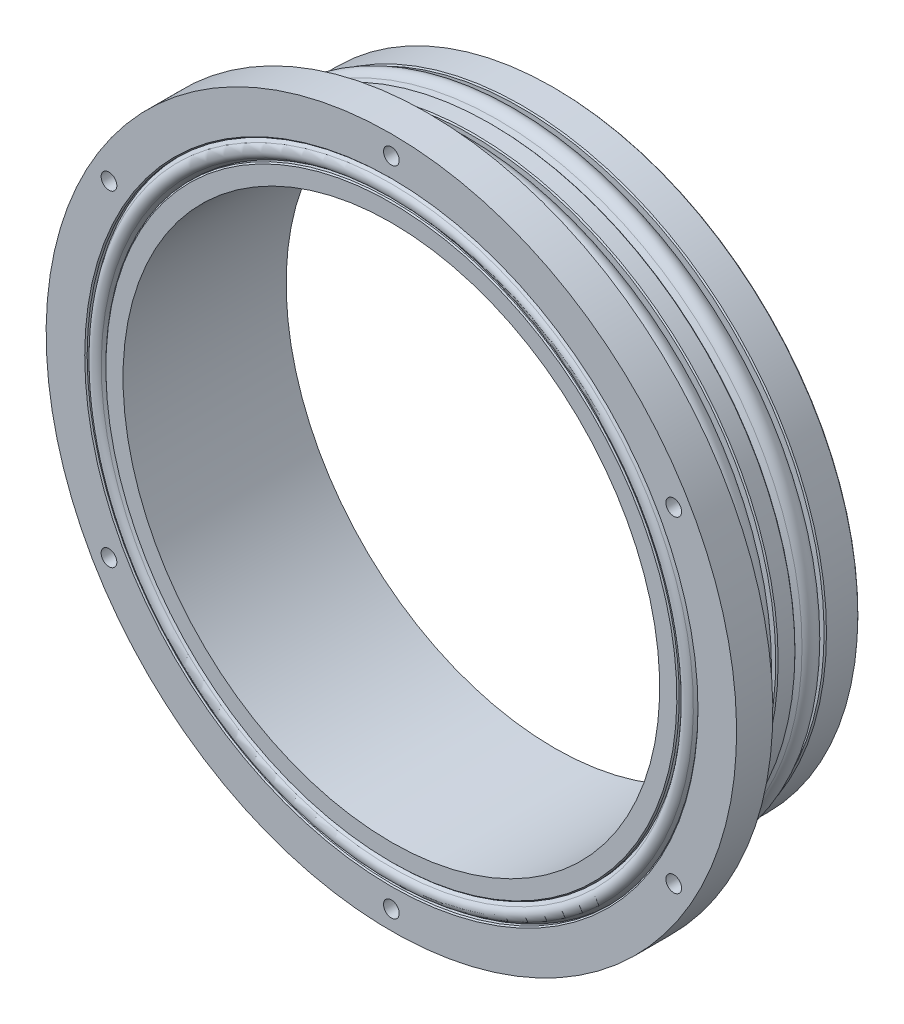
ISO-10303-21;
HEADER;
FILE_DESCRIPTION(('STEP AP214'),'2;1');
FILE_NAME('part.step','',(''),(''),'','','');
FILE_SCHEMA(('AUTOMOTIVE_DESIGN { 1 0 10303 214 1 1 1 1 }'));
ENDSEC;
DATA;
#1=APPLICATION_CONTEXT('core data for automotive mechanical design processes');
#2=APPLICATION_PROTOCOL_DEFINITION('international standard','automotive_design',2000,#1);
#3=PRODUCT_CONTEXT('',#1,'mechanical');
#4=PRODUCT('Part','Part','',(#3));
#5=PRODUCT_RELATED_PRODUCT_CATEGORY('part','',(#4));
#6=PRODUCT_DEFINITION_FORMATION('','',#4);
#7=PRODUCT_DEFINITION_CONTEXT('part definition',#1,'design');
#8=PRODUCT_DEFINITION('design','',#6,#7);
#9=PRODUCT_DEFINITION_SHAPE('','',#8);
#10=(LENGTH_UNIT() NAMED_UNIT(*) SI_UNIT(.MILLI.,.METRE.));
#11=(NAMED_UNIT(*) PLANE_ANGLE_UNIT() SI_UNIT($,.RADIAN.));
#12=(NAMED_UNIT(*) SI_UNIT($,.STERADIAN.) SOLID_ANGLE_UNIT());
#13=UNCERTAINTY_MEASURE_WITH_UNIT(LENGTH_MEASURE(1.E-05),#10,'distance_accuracy_value','');
#14=(GEOMETRIC_REPRESENTATION_CONTEXT(3) GLOBAL_UNCERTAINTY_ASSIGNED_CONTEXT((#13)) GLOBAL_UNIT_ASSIGNED_CONTEXT((#10,
#11,#12)) REPRESENTATION_CONTEXT('',''));
#15=CARTESIAN_POINT('',(0.,0.,0.));
#16=DIRECTION('',(0.,0.,1.));
#17=DIRECTION('',(1.,0.,0.));
#18=AXIS2_PLACEMENT_3D('',#15,#16,#17);
#19=CARTESIAN_POINT('',(0.,44.419,0.));
#20=DIRECTION('',(0.,0.,-1.));
#21=DIRECTION('',(0.,1.,0.));
#22=AXIS2_PLACEMENT_3D('',#19,#20,#21);
#23=PLANE('',#22);
#24=CARTESIAN_POINT('',(0.,-46.99,0.));
#25=DIRECTION('',(0.,0.,-1.));
#26=DIRECTION('',(0.,1.,0.));
#27=AXIS2_PLACEMENT_3D('',#24,#25,#26);
#28=CIRCLE('',#27,1.3);
#29=CARTESIAN_POINT('',(0.,-45.69,0.));
#30=VERTEX_POINT('',#29);
#31=EDGE_CURVE('E239',#30,#30,#28,.T.);
#32=ORIENTED_EDGE('',*,*,#31,.F.);
#33=EDGE_LOOP('',(#32));
#34=FACE_BOUND('',#33,.T.);
#35=CARTESIAN_POINT('',(-46.99,0.,0.));
#36=DIRECTION('',(0.,0.,-1.));
#37=DIRECTION('',(0.,1.,0.));
#38=AXIS2_PLACEMENT_3D('',#35,#36,#37);
#39=CIRCLE('',#38,1.3);
#40=CARTESIAN_POINT('',(-46.99,1.3,0.));
#41=VERTEX_POINT('',#40);
#42=EDGE_CURVE('E231',#41,#41,#39,.T.);
#43=ORIENTED_EDGE('',*,*,#42,.F.);
#44=EDGE_LOOP('',(#43));
#45=FACE_BOUND('',#44,.T.);
#46=CARTESIAN_POINT('',(0.,46.99,0.));
#47=DIRECTION('',(0.,0.,-1.));
#48=DIRECTION('',(0.,1.,0.));
#49=AXIS2_PLACEMENT_3D('',#46,#47,#48);
#50=CIRCLE('',#49,1.3);
#51=CARTESIAN_POINT('',(0.,48.29,0.));
#52=VERTEX_POINT('',#51);
#53=EDGE_CURVE('E223',#52,#52,#50,.T.);
#54=ORIENTED_EDGE('',*,*,#53,.F.);
#55=EDGE_LOOP('',(#54));
#56=FACE_BOUND('',#55,.T.);
#57=CARTESIAN_POINT('',(46.99,0.,0.));
#58=DIRECTION('',(0.,0.,-1.));
#59=DIRECTION('',(0.,1.,0.));
#60=AXIS2_PLACEMENT_3D('',#57,#58,#59);
#61=CIRCLE('',#60,1.3);
#62=CARTESIAN_POINT('',(46.99,1.3,0.));
#63=VERTEX_POINT('',#62);
#64=EDGE_CURVE('E215',#63,#63,#61,.T.);
#65=ORIENTED_EDGE('',*,*,#64,.F.);
#66=EDGE_LOOP('',(#65));
#67=FACE_BOUND('',#66,.T.);
#68=CARTESIAN_POINT('',(0.,0.,0.));
#69=DIRECTION('',(0.,0.,-1.));
#70=DIRECTION('',(0.,1.,0.));
#71=AXIS2_PLACEMENT_3D('',#68,#69,#70);
#72=CIRCLE('',#71,50.219);
#73=CARTESIAN_POINT('',(0.,50.219,0.));
#74=VERTEX_POINT('',#73);
#75=EDGE_CURVE('E79',#74,#74,#72,.T.);
#76=ORIENTED_EDGE('',*,*,#75,.T.);
#77=EDGE_LOOP('',(#76));
#78=FACE_BOUND('',#77,.T.);
#79=CARTESIAN_POINT('',(0.,0.,0.));
#80=DIRECTION('',(0.,0.,-1.));
#81=DIRECTION('',(0.,1.,0.));
#82=AXIS2_PLACEMENT_3D('',#79,#80,#81);
#83=CIRCLE('',#82,44.419);
#84=CARTESIAN_POINT('',(0.,44.419,0.));
#85=VERTEX_POINT('',#84);
#86=EDGE_CURVE('E162',#85,#85,#83,.T.);
#87=ORIENTED_EDGE('',*,*,#86,.F.);
#88=EDGE_LOOP('',(#87));
#89=FACE_BOUND('',#88,.T.);
#90=ADVANCED_FACE('F34',(#34,#45,#56,#67,#78,#89),#23,.T.);
#91=CARTESIAN_POINT('',(0.,0.,0.));
#92=DIRECTION('',(0.,0.,-1.));
#93=DIRECTION('',(0.,1.,0.));
#94=AXIS2_PLACEMENT_3D('',#91,#92,#93);
#95=CYLINDRICAL_SURFACE('',#94,50.419);
#96=CARTESIAN_POINT('',(0.,0.,0.199999999999944));
#97=DIRECTION('',(0.,0.,-1.));
#98=DIRECTION('',(0.,1.,0.));
#99=AXIS2_PLACEMENT_3D('',#96,#97,#98);
#100=CIRCLE('',#99,50.419);
#101=CARTESIAN_POINT('',(0.,50.419,0.199999999999951));
#102=VERTEX_POINT('',#101);
#103=EDGE_CURVE('E71',#102,#102,#100,.F.);
#104=ORIENTED_EDGE('',*,*,#103,.T.);
#105=EDGE_LOOP('',(#104));
#106=FACE_BOUND('',#105,.T.);
#107=CARTESIAN_POINT('',(0.,0.,5.387));
#108=DIRECTION('',(0.,0.,1.));
#109=DIRECTION('',(0.,-1.,0.));
#110=AXIS2_PLACEMENT_3D('',#107,#108,#109);
#111=CIRCLE('',#110,50.419);
#112=CARTESIAN_POINT('',(0.,-50.419,5.38699999999999));
#113=VERTEX_POINT('',#112);
#114=EDGE_CURVE('E75',#113,#113,#111,.F.);
#115=ORIENTED_EDGE('',*,*,#114,.T.);
#116=EDGE_LOOP('',(#115));
#117=FACE_BOUND('',#116,.T.);
#118=ADVANCED_FACE('F258',(#106,#117),#95,.T.);
#119=CARTESIAN_POINT('',(0.,49.04105,5.587));
#120=DIRECTION('',(0.,0.,1.));
#121=DIRECTION('',(0.,-1.,0.));
#122=AXIS2_PLACEMENT_3D('',#119,#120,#121);
#123=PLANE('',#122);
#124=CARTESIAN_POINT('',(0.,0.,5.58699999999999));
#125=DIRECTION('',(0.,0.,1.));
#126=DIRECTION('',(0.,-1.,0.));
#127=AXIS2_PLACEMENT_3D('',#124,#125,#126);
#128=CIRCLE('',#127,50.219);
#129=CARTESIAN_POINT('',(0.,-50.219,5.58699999999999));
#130=VERTEX_POINT('',#129);
#131=EDGE_CURVE('E59',#130,#130,#128,.T.);
#132=ORIENTED_EDGE('',*,*,#131,.T.);
#133=EDGE_LOOP('',(#132));
#134=FACE_BOUND('',#133,.T.);
#135=CARTESIAN_POINT('',(0.,0.,5.58699999999999));
#136=DIRECTION('',(0.,0.,-1.));
#137=DIRECTION('',(0.,1.,0.));
#138=AXIS2_PLACEMENT_3D('',#135,#136,#137);
#139=CIRCLE('',#138,49.04105);
#140=CARTESIAN_POINT('',(0.,49.04105,5.587));
#141=VERTEX_POINT('',#140);
#142=EDGE_CURVE('E99',#141,#141,#139,.T.);
#143=ORIENTED_EDGE('',*,*,#142,.T.);
#144=EDGE_LOOP('',(#143));
#145=FACE_BOUND('',#144,.T.);
#146=ADVANCED_FACE('F358',(#134,#145),#123,.T.);
#147=CARTESIAN_POINT('',(0.,0.,5.58699999999999));
#148=DIRECTION('',(0.,0.,1.));
#149=DIRECTION('',(0.,-1.,0.));
#150=AXIS2_PLACEMENT_3D('',#147,#148,#149);
#151=CONICAL_SURFACE('',#150,49.04105,0.966336052037726);
#152=CARTESIAN_POINT('',(0.,0.,6.54749535514835));
#153=DIRECTION('',(0.,0.,-1.));
#154=DIRECTION('',(0.,1.,0.));
#155=AXIS2_PLACEMENT_3D('',#152,#153,#154);
#156=CIRCLE('',#155,50.431651885961);
#157=CARTESIAN_POINT('',(0.,50.431651885961,6.54749535514836));
#158=VERTEX_POINT('',#157);
#159=EDGE_CURVE('E103',#158,#158,#156,.T.);
#160=ORIENTED_EDGE('',*,*,#159,.T.);
#161=EDGE_LOOP('',(#160));
#162=FACE_BOUND('',#161,.T.);
#163=ORIENTED_EDGE('',*,*,#142,.F.);
#164=EDGE_LOOP('',(#163));
#165=FACE_BOUND('',#164,.T.);
#166=ADVANCED_FACE('F354',(#162,#165),#151,.T.);
#167=CARTESIAN_POINT('',(0.,0.,7.99999999999999));
#168=DIRECTION('',(0.,0.,-1.));
#169=DIRECTION('',(0.,1.,0.));
#170=AXIS2_PLACEMENT_3D('',#167,#168,#169);
#171=TOROIDAL_SURFACE('',#170,49.4284,1.7653);
#172=CARTESIAN_POINT('',(0.,0.,9.45250464485164));
#173=DIRECTION('',(0.,0.,-1.));
#174=DIRECTION('',(0.,1.,0.));
#175=AXIS2_PLACEMENT_3D('',#172,#173,#174);
#176=CIRCLE('',#175,50.431651885961);
#177=CARTESIAN_POINT('',(0.,50.431651885961,9.45250464485164));
#178=VERTEX_POINT('',#177);
#179=EDGE_CURVE('E107',#178,#178,#176,.T.);
#180=ORIENTED_EDGE('',*,*,#179,.T.);
#181=EDGE_LOOP('',(#180));
#182=FACE_BOUND('',#181,.T.);
#183=ORIENTED_EDGE('',*,*,#159,.F.);
#184=EDGE_LOOP('',(#183));
#185=FACE_BOUND('',#184,.T.);
#186=ADVANCED_FACE('F350',(#182,#185),#171,.T.);
#187=CARTESIAN_POINT('',(0.,0.,9.45250464485164));
#188=DIRECTION('',(0.,0.,-1.));
#189=DIRECTION('',(0.,1.,0.));
#190=AXIS2_PLACEMENT_3D('',#187,#188,#189);
#191=CONICAL_SURFACE('',#190,50.431651885961,0.966336052037726);
#192=CARTESIAN_POINT('',(0.,0.,10.413));
#193=DIRECTION('',(0.,0.,-1.));
#194=DIRECTION('',(0.,1.,0.));
#195=AXIS2_PLACEMENT_3D('',#192,#193,#194);
#196=CIRCLE('',#195,49.04105);
#197=CARTESIAN_POINT('',(0.,49.04105,10.413));
#198=VERTEX_POINT('',#197);
#199=EDGE_CURVE('E111',#198,#198,#196,.T.);
#200=ORIENTED_EDGE('',*,*,#199,.T.);
#201=EDGE_LOOP('',(#200));
#202=FACE_BOUND('',#201,.T.);
#203=ORIENTED_EDGE('',*,*,#179,.F.);
#204=EDGE_LOOP('',(#203));
#205=FACE_BOUND('',#204,.T.);
#206=ADVANCED_FACE('F346',(#202,#205),#191,.T.);
#207=CARTESIAN_POINT('',(0.,50.419,10.413));
#208=DIRECTION('',(0.,0.,-1.));
#209=DIRECTION('',(0.,1.,0.));
#210=AXIS2_PLACEMENT_3D('',#207,#208,#209);
#211=PLANE('',#210);
#212=CARTESIAN_POINT('',(0.,0.,10.413));
#213=DIRECTION('',(0.,0.,-1.));
#214=DIRECTION('',(0.,1.,0.));
#215=AXIS2_PLACEMENT_3D('',#212,#213,#214);
#216=CIRCLE('',#215,50.219);
#217=CARTESIAN_POINT('',(0.,50.219,10.413));
#218=VERTEX_POINT('',#217);
#219=EDGE_CURVE('E54',#218,#218,#216,.T.);
#220=ORIENTED_EDGE('',*,*,#219,.T.);
#221=EDGE_LOOP('',(#220));
#222=FACE_BOUND('',#221,.T.);
#223=ORIENTED_EDGE('',*,*,#199,.F.);
#224=EDGE_LOOP('',(#223));
#225=FACE_BOUND('',#224,.T.);
#226=ADVANCED_FACE('F343',(#222,#225),#211,.T.);
#227=CARTESIAN_POINT('',(0.,0.,0.));
#228=DIRECTION('',(0.,0.,-1.));
#229=DIRECTION('',(0.,1.,0.));
#230=AXIS2_PLACEMENT_3D('',#227,#228,#229);
#231=CYLINDRICAL_SURFACE('',#230,50.419);
#232=CARTESIAN_POINT('',(0.,0.,10.613));
#233=DIRECTION('',(0.,0.,-1.));
#234=DIRECTION('',(0.,1.,0.));
#235=AXIS2_PLACEMENT_3D('',#232,#233,#234);
#236=CIRCLE('',#235,50.419);
#237=CARTESIAN_POINT('',(0.,50.419,10.613));
#238=VERTEX_POINT('',#237);
#239=EDGE_CURVE('E42',#238,#238,#236,.F.);
#240=ORIENTED_EDGE('',*,*,#239,.T.);
#241=EDGE_LOOP('',(#240));
#242=FACE_BOUND('',#241,.T.);
#243=CARTESIAN_POINT('',(0.,0.,13.387));
#244=DIRECTION('',(0.,0.,1.));
#245=DIRECTION('',(0.,-1.,0.));
#246=AXIS2_PLACEMENT_3D('',#243,#244,#245);
#247=CIRCLE('',#246,50.419);
#248=CARTESIAN_POINT('',(0.,-50.419,13.387));
#249=VERTEX_POINT('',#248);
#250=EDGE_CURVE('E49',#249,#249,#247,.F.);
#251=ORIENTED_EDGE('',*,*,#250,.T.);
#252=EDGE_LOOP('',(#251));
#253=FACE_BOUND('',#252,.T.);
#254=ADVANCED_FACE('F340',(#242,#253),#231,.T.);
#255=CARTESIAN_POINT('',(0.,49.04105,13.587));
#256=DIRECTION('',(0.,0.,1.));
#257=DIRECTION('',(0.,-1.,0.));
#258=AXIS2_PLACEMENT_3D('',#255,#256,#257);
#259=PLANE('',#258);
#260=CARTESIAN_POINT('',(0.,0.,13.587));
#261=DIRECTION('',(0.,0.,1.));
#262=DIRECTION('',(0.,-1.,0.));
#263=AXIS2_PLACEMENT_3D('',#260,#261,#262);
#264=CIRCLE('',#263,50.219);
#265=CARTESIAN_POINT('',(0.,-50.219,13.587));
#266=VERTEX_POINT('',#265);
#267=EDGE_CURVE('E10',#266,#266,#264,.T.);
#268=ORIENTED_EDGE('',*,*,#267,.T.);
#269=EDGE_LOOP('',(#268));
#270=FACE_BOUND('',#269,.T.);
#271=CARTESIAN_POINT('',(0.,0.,13.587));
#272=DIRECTION('',(0.,0.,-1.));
#273=DIRECTION('',(0.,1.,0.));
#274=AXIS2_PLACEMENT_3D('',#271,#272,#273);
#275=CIRCLE('',#274,49.04105);
#276=CARTESIAN_POINT('',(0.,49.04105,13.587));
#277=VERTEX_POINT('',#276);
#278=EDGE_CURVE('E115',#277,#277,#275,.T.);
#279=ORIENTED_EDGE('',*,*,#278,.T.);
#280=EDGE_LOOP('',(#279));
#281=FACE_BOUND('',#280,.T.);
#282=ADVANCED_FACE('F336',(#270,#281),#259,.T.);
#283=CARTESIAN_POINT('',(0.,0.,13.587));
#284=DIRECTION('',(0.,0.,1.));
#285=DIRECTION('',(0.,-1.,0.));
#286=AXIS2_PLACEMENT_3D('',#283,#284,#285);
#287=CONICAL_SURFACE('',#286,49.04105,0.966336052037727);
#288=CARTESIAN_POINT('',(0.,0.,14.5474953551484));
#289=DIRECTION('',(0.,0.,-1.));
#290=DIRECTION('',(0.,1.,0.));
#291=AXIS2_PLACEMENT_3D('',#288,#289,#290);
#292=CIRCLE('',#291,50.431651885961);
#293=CARTESIAN_POINT('',(0.,50.431651885961,14.5474953551484));
#294=VERTEX_POINT('',#293);
#295=EDGE_CURVE('E118',#294,#294,#292,.T.);
#296=ORIENTED_EDGE('',*,*,#295,.T.);
#297=EDGE_LOOP('',(#296));
#298=FACE_BOUND('',#297,.T.);
#299=ORIENTED_EDGE('',*,*,#278,.F.);
#300=EDGE_LOOP('',(#299));
#301=FACE_BOUND('',#300,.T.);
#302=ADVANCED_FACE('F332',(#298,#301),#287,.T.);
#303=CARTESIAN_POINT('',(0.,0.,16.));
#304=DIRECTION('',(0.,0.,-1.));
#305=DIRECTION('',(0.,1.,0.));
#306=AXIS2_PLACEMENT_3D('',#303,#304,#305);
#307=TOROIDAL_SURFACE('',#306,49.4284,1.7653);
#308=CARTESIAN_POINT('',(0.,0.,17.4525046448516));
#309=DIRECTION('',(0.,0.,-1.));
#310=DIRECTION('',(0.,1.,0.));
#311=AXIS2_PLACEMENT_3D('',#308,#309,#310);
#312=CIRCLE('',#311,50.431651885961);
#313=CARTESIAN_POINT('',(0.,50.431651885961,17.4525046448516));
#314=VERTEX_POINT('',#313);
#315=EDGE_CURVE('E122',#314,#314,#312,.T.);
#316=ORIENTED_EDGE('',*,*,#315,.T.);
#317=EDGE_LOOP('',(#316));
#318=FACE_BOUND('',#317,.T.);
#319=ORIENTED_EDGE('',*,*,#295,.F.);
#320=EDGE_LOOP('',(#319));
#321=FACE_BOUND('',#320,.T.);
#322=ADVANCED_FACE('F328',(#318,#321),#307,.T.);
#323=CARTESIAN_POINT('',(0.,0.,17.4525046448516));
#324=DIRECTION('',(0.,0.,-1.));
#325=DIRECTION('',(0.,1.,0.));
#326=AXIS2_PLACEMENT_3D('',#323,#324,#325);
#327=CONICAL_SURFACE('',#326,50.431651885961,0.966336052037724);
#328=CARTESIAN_POINT('',(0.,0.,18.413));
#329=DIRECTION('',(0.,0.,-1.));
#330=DIRECTION('',(0.,1.,0.));
#331=AXIS2_PLACEMENT_3D('',#328,#329,#330);
#332=CIRCLE('',#331,49.04105);
#333=CARTESIAN_POINT('',(0.,49.04105,18.413));
#334=VERTEX_POINT('',#333);
#335=EDGE_CURVE('E126',#334,#334,#332,.T.);
#336=ORIENTED_EDGE('',*,*,#335,.T.);
#337=EDGE_LOOP('',(#336));
#338=FACE_BOUND('',#337,.T.);
#339=ORIENTED_EDGE('',*,*,#315,.F.);
#340=EDGE_LOOP('',(#339));
#341=FACE_BOUND('',#340,.T.);
#342=ADVANCED_FACE('F324',(#338,#341),#327,.T.);
#343=CARTESIAN_POINT('',(0.,50.419,18.413));
#344=DIRECTION('',(0.,0.,-1.));
#345=DIRECTION('',(0.,1.,0.));
#346=AXIS2_PLACEMENT_3D('',#343,#344,#345);
#347=PLANE('',#346);
#348=CARTESIAN_POINT('',(0.,0.,18.413));
#349=DIRECTION('',(0.,0.,-1.));
#350=DIRECTION('',(0.,1.,0.));
#351=AXIS2_PLACEMENT_3D('',#348,#349,#350);
#352=CIRCLE('',#351,50.219);
#353=CARTESIAN_POINT('',(0.,50.219,18.413));
#354=VERTEX_POINT('',#353);
#355=EDGE_CURVE('E67',#354,#354,#352,.T.);
#356=ORIENTED_EDGE('',*,*,#355,.T.);
#357=EDGE_LOOP('',(#356));
#358=FACE_BOUND('',#357,.T.);
#359=ORIENTED_EDGE('',*,*,#335,.F.);
#360=EDGE_LOOP('',(#359));
#361=FACE_BOUND('',#360,.T.);
#362=ADVANCED_FACE('F320',(#358,#361),#347,.T.);
#363=CARTESIAN_POINT('',(0.,0.,0.));
#364=DIRECTION('',(0.,0.,-1.));
#365=DIRECTION('',(0.,1.,0.));
#366=AXIS2_PLACEMENT_3D('',#363,#364,#365);
#367=CYLINDRICAL_SURFACE('',#366,50.419);
#368=CARTESIAN_POINT('',(0.,0.,18.613));
#369=DIRECTION('',(0.,0.,-1.));
#370=DIRECTION('',(0.,1.,0.));
#371=AXIS2_PLACEMENT_3D('',#368,#369,#370);
#372=CIRCLE('',#371,50.419);
#373=CARTESIAN_POINT('',(0.,50.419,18.613));
#374=VERTEX_POINT('',#373);
#375=EDGE_CURVE('E63',#374,#374,#372,.F.);
#376=ORIENTED_EDGE('',*,*,#375,.T.);
#377=EDGE_LOOP('',(#376));
#378=FACE_BOUND('',#377,.T.);
#379=CARTESIAN_POINT('',(0.,0.,21.));
#380=DIRECTION('',(0.,0.,-1.));
#381=DIRECTION('',(0.,1.,0.));
#382=AXIS2_PLACEMENT_3D('',#379,#380,#381);
#383=CIRCLE('',#382,50.419);
#384=CARTESIAN_POINT('',(0.,50.419,21.));
#385=VERTEX_POINT('',#384);
#386=EDGE_CURVE('E130',#385,#385,#383,.T.);
#387=ORIENTED_EDGE('',*,*,#386,.T.);
#388=EDGE_LOOP('',(#387));
#389=FACE_BOUND('',#388,.T.);
#390=ADVANCED_FACE('F316',(#378,#389),#367,.T.);
#391=CARTESIAN_POINT('',(0.,50.419,21.));
#392=DIRECTION('',(0.,0.,-1.));
#393=DIRECTION('',(0.,1.,0.));
#394=AXIS2_PLACEMENT_3D('',#391,#392,#393);
#395=PLANE('',#394);
#396=CARTESIAN_POINT('',(-46.7437211692651,26.9875,21.));
#397=DIRECTION('',(0.,0.,-1.));
#398=DIRECTION('',(0.,1.,0.));
#399=AXIS2_PLACEMENT_3D('',#396,#397,#398);
#400=CIRCLE('',#399,1.3);
#401=CARTESIAN_POINT('',(-46.7437211692651,28.2875,21.));
#402=VERTEX_POINT('',#401);
#403=EDGE_CURVE('E206',#402,#402,#400,.F.);
#404=ORIENTED_EDGE('',*,*,#403,.T.);
#405=EDGE_LOOP('',(#404));
#406=FACE_BOUND('',#405,.T.);
#407=CARTESIAN_POINT('',(-46.7437211692651,-26.9875,21.));
#408=DIRECTION('',(0.,0.,-1.));
#409=DIRECTION('',(0.,1.,0.));
#410=AXIS2_PLACEMENT_3D('',#407,#408,#409);
#411=CIRCLE('',#410,1.3);
#412=CARTESIAN_POINT('',(-46.7437211692651,-25.6875,21.));
#413=VERTEX_POINT('',#412);
#414=EDGE_CURVE('E198',#413,#413,#411,.F.);
#415=ORIENTED_EDGE('',*,*,#414,.T.);
#416=EDGE_LOOP('',(#415));
#417=FACE_BOUND('',#416,.T.);
#418=CARTESIAN_POINT('',(0.,-53.975,21.));
#419=DIRECTION('',(0.,0.,-1.));
#420=DIRECTION('',(0.,1.,0.));
#421=AXIS2_PLACEMENT_3D('',#418,#419,#420);
#422=CIRCLE('',#421,1.3);
#423=CARTESIAN_POINT('',(0.,-52.675,21.));
#424=VERTEX_POINT('',#423);
#425=EDGE_CURVE('E190',#424,#424,#422,.F.);
#426=ORIENTED_EDGE('',*,*,#425,.T.);
#427=EDGE_LOOP('',(#426));
#428=FACE_BOUND('',#427,.T.);
#429=CARTESIAN_POINT('',(46.7437211692651,-26.9875,21.));
#430=DIRECTION('',(0.,0.,-1.));
#431=DIRECTION('',(0.,1.,0.));
#432=AXIS2_PLACEMENT_3D('',#429,#430,#431);
#433=CIRCLE('',#432,1.3);
#434=CARTESIAN_POINT('',(46.7437211692651,-25.6875,21.));
#435=VERTEX_POINT('',#434);
#436=EDGE_CURVE('E182',#435,#435,#433,.F.);
#437=ORIENTED_EDGE('',*,*,#436,.T.);
#438=EDGE_LOOP('',(#437));
#439=FACE_BOUND('',#438,.T.);
#440=CARTESIAN_POINT('',(46.7437211692651,26.9875,21.));
#441=DIRECTION('',(0.,0.,-1.));
#442=DIRECTION('',(0.,1.,0.));
#443=AXIS2_PLACEMENT_3D('',#440,#441,#442);
#444=CIRCLE('',#443,1.3);
#445=CARTESIAN_POINT('',(46.7437211692651,28.2875,21.));
#446=VERTEX_POINT('',#445);
#447=EDGE_CURVE('E174',#446,#446,#444,.F.);
#448=ORIENTED_EDGE('',*,*,#447,.T.);
#449=EDGE_LOOP('',(#448));
#450=FACE_BOUND('',#449,.T.);
#451=CARTESIAN_POINT('',(0.,53.975,21.));
#452=DIRECTION('',(0.,0.,-1.));
#453=DIRECTION('',(0.,1.,0.));
#454=AXIS2_PLACEMENT_3D('',#451,#452,#453);
#455=CIRCLE('',#454,1.3);
#456=CARTESIAN_POINT('',(0.,55.275,21.));
#457=VERTEX_POINT('',#456);
#458=EDGE_CURVE('E166',#457,#457,#455,.F.);
#459=ORIENTED_EDGE('',*,*,#458,.T.);
#460=EDGE_LOOP('',(#459));
#461=FACE_BOUND('',#460,.T.);
#462=CARTESIAN_POINT('',(0.,0.,21.));
#463=DIRECTION('',(0.,0.,-1.));
#464=DIRECTION('',(0.,1.,0.));
#465=AXIS2_PLACEMENT_3D('',#462,#463,#464);
#466=CIRCLE('',#465,57.15);
#467=CARTESIAN_POINT('',(0.,57.15,21.));
#468=VERTEX_POINT('',#467);
#469=EDGE_CURVE('E134',#468,#468,#466,.T.);
#470=ORIENTED_EDGE('',*,*,#469,.T.);
#471=EDGE_LOOP('',(#470));
#472=FACE_BOUND('',#471,.T.);
#473=ORIENTED_EDGE('',*,*,#386,.F.);
#474=EDGE_LOOP('',(#473));
#475=FACE_BOUND('',#474,.T.);
#476=ADVANCED_FACE('F312',(#406,#417,#428,#439,#450,#461,#472,#475),#395,.T.);
#477=CARTESIAN_POINT('',(0.,0.,0.));
#478=DIRECTION('',(0.,0.,-1.));
#479=DIRECTION('',(0.,1.,0.));
#480=AXIS2_PLACEMENT_3D('',#477,#478,#479);
#481=CYLINDRICAL_SURFACE('',#480,57.15);
#482=CARTESIAN_POINT('',(0.,0.,27.));
#483=DIRECTION('',(0.,0.,-1.));
#484=DIRECTION('',(0.,1.,0.));
#485=AXIS2_PLACEMENT_3D('',#482,#483,#484);
#486=CIRCLE('',#485,57.15);
#487=CARTESIAN_POINT('',(0.,57.15,27.));
#488=VERTEX_POINT('',#487);
#489=EDGE_CURVE('E138',#488,#488,#486,.T.);
#490=ORIENTED_EDGE('',*,*,#489,.T.);
#491=EDGE_LOOP('',(#490));
#492=FACE_BOUND('',#491,.T.);
#493=ORIENTED_EDGE('',*,*,#469,.F.);
#494=EDGE_LOOP('',(#493));
#495=FACE_BOUND('',#494,.T.);
#496=ADVANCED_FACE('F308',(#492,#495),#481,.T.);
#497=CARTESIAN_POINT('',(0.,57.15,27.));
#498=DIRECTION('',(0.,0.,1.));
#499=DIRECTION('',(0.,-1.,0.));
#500=AXIS2_PLACEMENT_3D('',#497,#498,#499);
#501=PLANE('',#500);
#502=CARTESIAN_POINT('',(0.,0.,27.));
#503=DIRECTION('',(0.,0.,1.));
#504=DIRECTION('',(0.,-1.,0.));
#505=AXIS2_PLACEMENT_3D('',#502,#503,#504);
#506=CIRCLE('',#505,50.7587);
#507=CARTESIAN_POINT('',(0.,-50.7587,27.));
#508=VERTEX_POINT('',#507);
#509=EDGE_CURVE('E95',#508,#508,#506,.F.);
#510=ORIENTED_EDGE('',*,*,#509,.T.);
#511=EDGE_LOOP('',(#510));
#512=FACE_BOUND('',#511,.T.);
#513=CARTESIAN_POINT('',(-46.7437211692651,26.9875,27.));
#514=DIRECTION('',(0.,0.,1.));
#515=DIRECTION('',(1.,0.,0.));
#516=AXIS2_PLACEMENT_3D('',#513,#514,#515);
#517=CIRCLE('',#516,1.3);
#518=CARTESIAN_POINT('',(-45.4437211692651,26.9875,27.));
#519=VERTEX_POINT('',#518);
#520=EDGE_CURVE('E210',#519,#519,#517,.T.);
#521=ORIENTED_EDGE('',*,*,#520,.F.);
#522=EDGE_LOOP('',(#521));
#523=FACE_BOUND('',#522,.T.);
#524=CARTESIAN_POINT('',(-46.7437211692651,-26.9875,27.));
#525=DIRECTION('',(0.,0.,1.));
#526=DIRECTION('',(1.,0.,0.));
#527=AXIS2_PLACEMENT_3D('',#524,#525,#526);
#528=CIRCLE('',#527,1.3);
#529=CARTESIAN_POINT('',(-45.4437211692651,-26.9875,27.));
#530=VERTEX_POINT('',#529);
#531=EDGE_CURVE('E202',#530,#530,#528,.T.);
#532=ORIENTED_EDGE('',*,*,#531,.F.);
#533=EDGE_LOOP('',(#532));
#534=FACE_BOUND('',#533,.T.);
#535=CARTESIAN_POINT('',(0.,-53.975,27.));
#536=DIRECTION('',(0.,0.,1.));
#537=DIRECTION('',(1.,0.,0.));
#538=AXIS2_PLACEMENT_3D('',#535,#536,#537);
#539=CIRCLE('',#538,1.3);
#540=CARTESIAN_POINT('',(1.30000000000001,-53.975,27.));
#541=VERTEX_POINT('',#540);
#542=EDGE_CURVE('E194',#541,#541,#539,.T.);
#543=ORIENTED_EDGE('',*,*,#542,.F.);
#544=EDGE_LOOP('',(#543));
#545=FACE_BOUND('',#544,.T.);
#546=CARTESIAN_POINT('',(46.7437211692651,-26.9875,27.));
#547=DIRECTION('',(0.,0.,1.));
#548=DIRECTION('',(1.,0.,0.));
#549=AXIS2_PLACEMENT_3D('',#546,#547,#548);
#550=CIRCLE('',#549,1.3);
#551=CARTESIAN_POINT('',(48.0437211692651,-26.9875,27.));
#552=VERTEX_POINT('',#551);
#553=EDGE_CURVE('E186',#552,#552,#550,.T.);
#554=ORIENTED_EDGE('',*,*,#553,.F.);
#555=EDGE_LOOP('',(#554));
#556=FACE_BOUND('',#555,.T.);
#557=CARTESIAN_POINT('',(46.7437211692651,26.9875,27.));
#558=DIRECTION('',(0.,0.,1.));
#559=DIRECTION('',(1.,0.,0.));
#560=AXIS2_PLACEMENT_3D('',#557,#558,#559);
#561=CIRCLE('',#560,1.3);
#562=CARTESIAN_POINT('',(48.0437211692651,26.9875,27.));
#563=VERTEX_POINT('',#562);
#564=EDGE_CURVE('E178',#563,#563,#561,.T.);
#565=ORIENTED_EDGE('',*,*,#564,.F.);
#566=EDGE_LOOP('',(#565));
#567=FACE_BOUND('',#566,.T.);
#568=CARTESIAN_POINT('',(0.,53.975,27.));
#569=DIRECTION('',(0.,0.,1.));
#570=DIRECTION('',(1.,0.,0.));
#571=AXIS2_PLACEMENT_3D('',#568,#569,#570);
#572=CIRCLE('',#571,1.3);
#573=CARTESIAN_POINT('',(1.3,53.975,27.));
#574=VERTEX_POINT('',#573);
#575=EDGE_CURVE('E170',#574,#574,#572,.T.);
#576=ORIENTED_EDGE('',*,*,#575,.F.);
#577=EDGE_LOOP('',(#576));
#578=FACE_BOUND('',#577,.T.);
#579=ORIENTED_EDGE('',*,*,#489,.F.);
#580=EDGE_LOOP('',(#579));
#581=FACE_BOUND('',#580,.T.);
#582=ADVANCED_FACE('F304',(#512,#523,#534,#545,#556,#567,#578,#581),#501,.T.);
#583=CARTESIAN_POINT('',(0.,0.,0.));
#584=DIRECTION('',(0.,0.,-1.));
#585=DIRECTION('',(0.,1.,0.));
#586=AXIS2_PLACEMENT_3D('',#583,#584,#585);
#587=CYLINDRICAL_SURFACE('',#586,50.5587);
#588=CARTESIAN_POINT('',(0.,0.,26.8));
#589=DIRECTION('',(0.,0.,1.));
#590=DIRECTION('',(0.,-1.,0.));
#591=AXIS2_PLACEMENT_3D('',#588,#589,#590);
#592=CIRCLE('',#591,50.5587);
#593=CARTESIAN_POINT('',(0.,-50.5587,26.8));
#594=VERTEX_POINT('',#593);
#595=EDGE_CURVE('E91',#594,#594,#592,.T.);
#596=ORIENTED_EDGE('',*,*,#595,.T.);
#597=EDGE_LOOP('',(#596));
#598=FACE_BOUND('',#597,.T.);
#599=CARTESIAN_POINT('',(0.,0.,26.2791702351356));
#600=DIRECTION('',(0.,0.,-1.));
#601=DIRECTION('',(0.,1.,0.));
#602=AXIS2_PLACEMENT_3D('',#599,#600,#601);
#603=CIRCLE('',#602,50.5587);
#604=CARTESIAN_POINT('',(0.,50.5587,26.2791702351356));
#605=VERTEX_POINT('',#604);
#606=EDGE_CURVE('E142',#605,#605,#603,.T.);
#607=ORIENTED_EDGE('',*,*,#606,.T.);
#608=EDGE_LOOP('',(#607));
#609=FACE_BOUND('',#608,.T.);
#610=ADVANCED_FACE('F300',(#598,#609),#587,.F.);
#611=CARTESIAN_POINT('',(0.,0.,26.2791702351356));
#612=DIRECTION('',(0.,0.,-1.));
#613=DIRECTION('',(0.,1.,0.));
#614=AXIS2_PLACEMENT_3D('',#611,#612,#613);
#615=CONICAL_SURFACE('',#614,50.5587,0.634842696572141);
#616=CARTESIAN_POINT('',(0.,0.,27.0190146200091));
#617=DIRECTION('',(0.,0.,-1.));
#618=DIRECTION('',(0.,1.,0.));
#619=AXIS2_PLACEMENT_3D('',#616,#617,#618);
#620=CIRCLE('',#619,50.0137615637377);
#621=CARTESIAN_POINT('',(0.,50.0137615637377,27.0190146200091));
#622=VERTEX_POINT('',#621);
#623=EDGE_CURVE('E146',#622,#622,#620,.T.);
#624=ORIENTED_EDGE('',*,*,#623,.T.);
#625=EDGE_LOOP('',(#624));
#626=FACE_BOUND('',#625,.T.);
#627=ORIENTED_EDGE('',*,*,#606,.F.);
#628=EDGE_LOOP('',(#627));
#629=FACE_BOUND('',#628,.T.);
#630=ADVANCED_FACE('F296',(#626,#629),#615,.T.);
#631=CARTESIAN_POINT('',(0.,0.,26.2791702351356));
#632=DIRECTION('',(0.,0.,-1.));
#633=DIRECTION('',(0.,1.,0.));
#634=AXIS2_PLACEMENT_3D('',#631,#632,#633);
#635=TOROIDAL_SURFACE('',#634,49.0093,1.24752264382461);
#636=CARTESIAN_POINT('',(0.,0.,27.0190146200091));
#637=DIRECTION('',(0.,0.,-1.));
#638=DIRECTION('',(0.,1.,0.));
#639=AXIS2_PLACEMENT_3D('',#636,#637,#638);
#640=CIRCLE('',#639,48.0048384362623);
#641=CARTESIAN_POINT('',(0.,48.0048384362623,27.0190146200091));
#642=VERTEX_POINT('',#641);
#643=EDGE_CURVE('E150',#642,#642,#640,.T.);
#644=ORIENTED_EDGE('',*,*,#643,.T.);
#645=EDGE_LOOP('',(#644));
#646=FACE_BOUND('',#645,.T.);
#647=ORIENTED_EDGE('',*,*,#623,.F.);
#648=EDGE_LOOP('',(#647));
#649=FACE_BOUND('',#648,.T.);
#650=ADVANCED_FACE('F292',(#646,#649),#635,.T.);
#651=CARTESIAN_POINT('',(0.,0.,27.0190146200091));
#652=DIRECTION('',(0.,0.,1.));
#653=DIRECTION('',(0.,-1.,0.));
#654=AXIS2_PLACEMENT_3D('',#651,#652,#653);
#655=CONICAL_SURFACE('',#654,48.0048384362623,0.634842696572118);
#656=CARTESIAN_POINT('',(0.,0.,26.2791702351356));
#657=DIRECTION('',(0.,0.,-1.));
#658=DIRECTION('',(0.,1.,0.));
#659=AXIS2_PLACEMENT_3D('',#656,#657,#658);
#660=CIRCLE('',#659,47.4599);
#661=CARTESIAN_POINT('',(0.,47.4599,26.2791702351356));
#662=VERTEX_POINT('',#661);
#663=EDGE_CURVE('E154',#662,#662,#660,.T.);
#664=ORIENTED_EDGE('',*,*,#663,.T.);
#665=EDGE_LOOP('',(#664));
#666=FACE_BOUND('',#665,.T.);
#667=ORIENTED_EDGE('',*,*,#643,.F.);
#668=EDGE_LOOP('',(#667));
#669=FACE_BOUND('',#668,.T.);
#670=ADVANCED_FACE('F285',(#666,#669),#655,.F.);
#671=CARTESIAN_POINT('',(0.,0.,0.));
#672=DIRECTION('',(0.,0.,-1.));
#673=DIRECTION('',(0.,1.,0.));
#674=AXIS2_PLACEMENT_3D('',#671,#672,#673);
#675=CYLINDRICAL_SURFACE('',#674,47.4599);
#676=CARTESIAN_POINT('',(0.,0.,26.8));
#677=DIRECTION('',(0.,0.,1.));
#678=DIRECTION('',(0.,-1.,0.));
#679=AXIS2_PLACEMENT_3D('',#676,#677,#678);
#680=CIRCLE('',#679,47.4599);
#681=CARTESIAN_POINT('',(0.,-47.4599,26.8));
#682=VERTEX_POINT('',#681);
#683=EDGE_CURVE('E87',#682,#682,#680,.F.);
#684=ORIENTED_EDGE('',*,*,#683,.T.);
#685=EDGE_LOOP('',(#684));
#686=FACE_BOUND('',#685,.T.);
#687=ORIENTED_EDGE('',*,*,#663,.F.);
#688=EDGE_LOOP('',(#687));
#689=FACE_BOUND('',#688,.T.);
#690=ADVANCED_FACE('F279',(#686,#689),#675,.T.);
#691=CARTESIAN_POINT('',(0.,47.4599,27.));
#692=DIRECTION('',(0.,0.,1.));
#693=DIRECTION('',(0.,-1.,0.));
#694=AXIS2_PLACEMENT_3D('',#691,#692,#693);
#695=PLANE('',#694);
#696=CARTESIAN_POINT('',(0.,0.,27.));
#697=DIRECTION('',(0.,0.,1.));
#698=DIRECTION('',(0.,-1.,0.));
#699=AXIS2_PLACEMENT_3D('',#696,#697,#698);
#700=CIRCLE('',#699,47.2599);
#701=CARTESIAN_POINT('',(0.,-47.2599,27.));
#702=VERTEX_POINT('',#701);
#703=EDGE_CURVE('E83',#702,#702,#700,.T.);
#704=ORIENTED_EDGE('',*,*,#703,.T.);
#705=EDGE_LOOP('',(#704));
#706=FACE_BOUND('',#705,.T.);
#707=CARTESIAN_POINT('',(0.,0.,27.));
#708=DIRECTION('',(0.,0.,-1.));
#709=DIRECTION('',(0.,1.,0.));
#710=AXIS2_PLACEMENT_3D('',#707,#708,#709);
#711=CIRCLE('',#710,44.419);
#712=CARTESIAN_POINT('',(0.,44.419,27.));
#713=VERTEX_POINT('',#712);
#714=EDGE_CURVE('E158',#713,#713,#711,.T.);
#715=ORIENTED_EDGE('',*,*,#714,.T.);
#716=EDGE_LOOP('',(#715));
#717=FACE_BOUND('',#716,.T.);
#718=ADVANCED_FACE('F274',(#706,#717),#695,.T.);
#719=CARTESIAN_POINT('',(0.,0.,0.));
#720=DIRECTION('',(0.,0.,-1.));
#721=DIRECTION('',(0.,1.,0.));
#722=AXIS2_PLACEMENT_3D('',#719,#720,#721);
#723=CYLINDRICAL_SURFACE('',#722,44.419);
#724=ORIENTED_EDGE('',*,*,#86,.T.);
#725=EDGE_LOOP('',(#724));
#726=FACE_BOUND('',#725,.T.);
#727=ORIENTED_EDGE('',*,*,#714,.F.);
#728=EDGE_LOOP('',(#727));
#729=FACE_BOUND('',#728,.T.);
#730=ADVANCED_FACE('F270',(#726,#729),#723,.F.);
#731=CARTESIAN_POINT('',(0.,53.975,17.3230447378299));
#732=DIRECTION('',(0.,0.,1.));
#733=DIRECTION('',(1.,0.,0.));
#734=AXIS2_PLACEMENT_3D('',#731,#732,#733);
#735=CYLINDRICAL_SURFACE('',#734,1.3);
#736=ORIENTED_EDGE('',*,*,#575,.T.);
#737=EDGE_LOOP('',(#736));
#738=FACE_BOUND('',#737,.T.);
#739=ORIENTED_EDGE('',*,*,#458,.F.);
#740=EDGE_LOOP('',(#739));
#741=FACE_BOUND('',#740,.T.);
#742=ADVANCED_FACE('F273',(#738,#741),#735,.F.);
#743=CARTESIAN_POINT('',(46.7437211692651,26.9875,17.3230447378299));
#744=DIRECTION('',(0.,0.,1.));
#745=DIRECTION('',(1.,0.,0.));
#746=AXIS2_PLACEMENT_3D('',#743,#744,#745);
#747=CYLINDRICAL_SURFACE('',#746,1.3);
#748=ORIENTED_EDGE('',*,*,#564,.T.);
#749=EDGE_LOOP('',(#748));
#750=FACE_BOUND('',#749,.T.);
#751=ORIENTED_EDGE('',*,*,#447,.F.);
#752=EDGE_LOOP('',(#751));
#753=FACE_BOUND('',#752,.T.);
#754=ADVANCED_FACE('F438',(#750,#753),#747,.F.);
#755=CARTESIAN_POINT('',(46.7437211692651,-26.9875,17.3230447378299));
#756=DIRECTION('',(0.,0.,1.));
#757=DIRECTION('',(1.,0.,0.));
#758=AXIS2_PLACEMENT_3D('',#755,#756,#757);
#759=CYLINDRICAL_SURFACE('',#758,1.3);
#760=ORIENTED_EDGE('',*,*,#553,.T.);
#761=EDGE_LOOP('',(#760));
#762=FACE_BOUND('',#761,.T.);
#763=ORIENTED_EDGE('',*,*,#436,.F.);
#764=EDGE_LOOP('',(#763));
#765=FACE_BOUND('',#764,.T.);
#766=ADVANCED_FACE('F434',(#762,#765),#759,.F.);
#767=CARTESIAN_POINT('',(0.,-53.975,17.3230447378299));
#768=DIRECTION('',(0.,0.,1.));
#769=DIRECTION('',(1.,0.,0.));
#770=AXIS2_PLACEMENT_3D('',#767,#768,#769);
#771=CYLINDRICAL_SURFACE('',#770,1.3);
#772=ORIENTED_EDGE('',*,*,#542,.T.);
#773=EDGE_LOOP('',(#772));
#774=FACE_BOUND('',#773,.T.);
#775=ORIENTED_EDGE('',*,*,#425,.F.);
#776=EDGE_LOOP('',(#775));
#777=FACE_BOUND('',#776,.T.);
#778=ADVANCED_FACE('F430',(#774,#777),#771,.F.);
#779=CARTESIAN_POINT('',(-46.7437211692651,-26.9875,17.3230447378299));
#780=DIRECTION('',(0.,0.,1.));
#781=DIRECTION('',(1.,0.,0.));
#782=AXIS2_PLACEMENT_3D('',#779,#780,#781);
#783=CYLINDRICAL_SURFACE('',#782,1.3);
#784=ORIENTED_EDGE('',*,*,#531,.T.);
#785=EDGE_LOOP('',(#784));
#786=FACE_BOUND('',#785,.T.);
#787=ORIENTED_EDGE('',*,*,#414,.F.);
#788=EDGE_LOOP('',(#787));
#789=FACE_BOUND('',#788,.T.);
#790=ADVANCED_FACE('F426',(#786,#789),#783,.F.);
#791=CARTESIAN_POINT('',(-46.7437211692651,26.9875,17.3230447378299));
#792=DIRECTION('',(0.,0.,1.));
#793=DIRECTION('',(1.,0.,0.));
#794=AXIS2_PLACEMENT_3D('',#791,#792,#793);
#795=CYLINDRICAL_SURFACE('',#794,1.3);
#796=ORIENTED_EDGE('',*,*,#520,.T.);
#797=EDGE_LOOP('',(#796));
#798=FACE_BOUND('',#797,.T.);
#799=ORIENTED_EDGE('',*,*,#403,.F.);
#800=EDGE_LOOP('',(#799));
#801=FACE_BOUND('',#800,.T.);
#802=ADVANCED_FACE('F370',(#798,#801),#795,.F.);
#803=CARTESIAN_POINT('',(0.,0.,27.));
#804=DIRECTION('',(0.,0.,1.));
#805=DIRECTION('',(0.,-1.,0.));
#806=AXIS2_PLACEMENT_3D('',#803,#804,#805);
#807=CONICAL_SURFACE('',#806,50.7587,0.785398163397448);
#808=ORIENTED_EDGE('',*,*,#595,.F.);
#809=EDGE_LOOP('',(#808));
#810=FACE_BOUND('',#809,.T.);
#811=ORIENTED_EDGE('',*,*,#509,.F.);
#812=EDGE_LOOP('',(#811));
#813=FACE_BOUND('',#812,.T.);
#814=ADVANCED_FACE('F366',(#810,#813),#807,.F.);
#815=CARTESIAN_POINT('',(0.,0.,26.8));
#816=DIRECTION('',(0.,0.,-1.));
#817=DIRECTION('',(0.,1.,0.));
#818=AXIS2_PLACEMENT_3D('',#815,#816,#817);
#819=CONICAL_SURFACE('',#818,47.4599,0.785398163397414);
#820=ORIENTED_EDGE('',*,*,#703,.F.);
#821=EDGE_LOOP('',(#820));
#822=FACE_BOUND('',#821,.T.);
#823=ORIENTED_EDGE('',*,*,#683,.F.);
#824=EDGE_LOOP('',(#823));
#825=FACE_BOUND('',#824,.T.);
#826=ADVANCED_FACE('F369',(#822,#825),#819,.T.);
#827=CARTESIAN_POINT('',(0.,0.,0.));
#828=DIRECTION('',(0.,0.,1.));
#829=DIRECTION('',(0.,-1.,0.));
#830=AXIS2_PLACEMENT_3D('',#827,#828,#829);
#831=CONICAL_SURFACE('',#830,50.219,0.7853981633975);
#832=ORIENTED_EDGE('',*,*,#103,.F.);
#833=EDGE_LOOP('',(#832));
#834=FACE_BOUND('',#833,.T.);
#835=ORIENTED_EDGE('',*,*,#75,.F.);
#836=EDGE_LOOP('',(#835));
#837=FACE_BOUND('',#836,.T.);
#838=ADVANCED_FACE('F374',(#834,#837),#831,.T.);
#839=CARTESIAN_POINT('',(0.,0.,18.413));
#840=DIRECTION('',(0.,0.,1.));
#841=DIRECTION('',(0.,-1.,0.));
#842=AXIS2_PLACEMENT_3D('',#839,#840,#841);
#843=CONICAL_SURFACE('',#842,50.219,0.785398163397431);
#844=ORIENTED_EDGE('',*,*,#375,.F.);
#845=EDGE_LOOP('',(#844));
#846=FACE_BOUND('',#845,.T.);
#847=ORIENTED_EDGE('',*,*,#355,.F.);
#848=EDGE_LOOP('',(#847));
#849=FACE_BOUND('',#848,.T.);
#850=ADVANCED_FACE('F378',(#846,#849),#843,.T.);
#851=CARTESIAN_POINT('',(0.,0.,5.387));
#852=DIRECTION('',(0.,0.,-1.));
#853=DIRECTION('',(0.,1.,0.));
#854=AXIS2_PLACEMENT_3D('',#851,#852,#853);
#855=CONICAL_SURFACE('',#854,50.419,0.785398163397431);
#856=ORIENTED_EDGE('',*,*,#131,.F.);
#857=EDGE_LOOP('',(#856));
#858=FACE_BOUND('',#857,.T.);
#859=ORIENTED_EDGE('',*,*,#114,.F.);
#860=EDGE_LOOP('',(#859));
#861=FACE_BOUND('',#860,.T.);
#862=ADVANCED_FACE('F382',(#858,#861),#855,.T.);
#863=CARTESIAN_POINT('',(0.,0.,10.413));
#864=DIRECTION('',(0.,0.,1.));
#865=DIRECTION('',(0.,-1.,0.));
#866=AXIS2_PLACEMENT_3D('',#863,#864,#865);
#867=CONICAL_SURFACE('',#866,50.219,0.785398163397431);
#868=ORIENTED_EDGE('',*,*,#239,.F.);
#869=EDGE_LOOP('',(#868));
#870=FACE_BOUND('',#869,.T.);
#871=ORIENTED_EDGE('',*,*,#219,.F.);
#872=EDGE_LOOP('',(#871));
#873=FACE_BOUND('',#872,.T.);
#874=ADVANCED_FACE('F385',(#870,#873),#867,.T.);
#875=CARTESIAN_POINT('',(0.,0.,13.387));
#876=DIRECTION('',(0.,0.,-1.));
#877=DIRECTION('',(0.,1.,0.));
#878=AXIS2_PLACEMENT_3D('',#875,#876,#877);
#879=CONICAL_SURFACE('',#878,50.419,0.785398163397466);
#880=ORIENTED_EDGE('',*,*,#267,.F.);
#881=EDGE_LOOP('',(#880));
#882=FACE_BOUND('',#881,.T.);
#883=ORIENTED_EDGE('',*,*,#250,.F.);
#884=EDGE_LOOP('',(#883));
#885=FACE_BOUND('',#884,.T.);
#886=ADVANCED_FACE('F36',(#882,#885),#879,.T.);
#887=CARTESIAN_POINT('',(46.99,0.,4.));
#888=DIRECTION('',(0.,0.,-1.));
#889=DIRECTION('',(0.,1.,0.));
#890=AXIS2_PLACEMENT_3D('',#887,#888,#889);
#891=CYLINDRICAL_SURFACE('',#890,1.3);
#892=CARTESIAN_POINT('',(46.99,0.,4.));
#893=DIRECTION('',(0.,0.,-1.));
#894=DIRECTION('',(0.,1.,0.));
#895=AXIS2_PLACEMENT_3D('',#892,#893,#894);
#896=CIRCLE('',#895,1.3);
#897=CARTESIAN_POINT('',(46.99,1.3,4.));
#898=VERTEX_POINT('',#897);
#899=EDGE_CURVE('E214',#898,#898,#896,.T.);
#900=ORIENTED_EDGE('',*,*,#899,.F.);
#901=EDGE_LOOP('',(#900));
#902=FACE_BOUND('',#901,.T.);
#903=ORIENTED_EDGE('',*,*,#64,.T.);
#904=EDGE_LOOP('',(#903));
#905=FACE_BOUND('',#904,.T.);
#906=ADVANCED_FACE('F392',(#902,#905),#891,.F.);
#907=CARTESIAN_POINT('',(46.99,0.,4.));
#908=DIRECTION('',(0.,0.,-1.));
#909=DIRECTION('',(0.,1.,0.));
#910=AXIS2_PLACEMENT_3D('',#907,#908,#909);
#911=PLANE('',#910);
#912=ORIENTED_EDGE('',*,*,#899,.T.);
#913=EDGE_LOOP('',(#912));
#914=FACE_BOUND('',#913,.T.);
#915=ADVANCED_FACE('F408',(#914),#911,.T.);
#916=CARTESIAN_POINT('',(0.,46.99,4.00000000000001));
#917=DIRECTION('',(0.,0.,-1.));
#918=DIRECTION('',(0.,1.,0.));
#919=AXIS2_PLACEMENT_3D('',#916,#917,#918);
#920=CYLINDRICAL_SURFACE('',#919,1.3);
#921=CARTESIAN_POINT('',(0.,46.99,4.00000000000001));
#922=DIRECTION('',(0.,0.,-1.));
#923=DIRECTION('',(0.,1.,0.));
#924=AXIS2_PLACEMENT_3D('',#921,#922,#923);
#925=CIRCLE('',#924,1.3);
#926=CARTESIAN_POINT('',(0.,48.29,4.00000000000001));
#927=VERTEX_POINT('',#926);
#928=EDGE_CURVE('E219',#927,#927,#925,.T.);
#929=ORIENTED_EDGE('',*,*,#928,.F.);
#930=EDGE_LOOP('',(#929));
#931=FACE_BOUND('',#930,.T.);
#932=ORIENTED_EDGE('',*,*,#53,.T.);
#933=EDGE_LOOP('',(#932));
#934=FACE_BOUND('',#933,.T.);
#935=ADVANCED_FACE('F417',(#931,#934),#920,.F.);
#936=CARTESIAN_POINT('',(0.,46.99,4.00000000000001));
#937=DIRECTION('',(0.,0.,-1.));
#938=DIRECTION('',(0.,1.,0.));
#939=AXIS2_PLACEMENT_3D('',#936,#937,#938);
#940=PLANE('',#939);
#941=ORIENTED_EDGE('',*,*,#928,.T.);
#942=EDGE_LOOP('',(#941));
#943=FACE_BOUND('',#942,.T.);
#944=ADVANCED_FACE('F541',(#943),#940,.T.);
#945=CARTESIAN_POINT('',(-46.99,0.,4.));
#946=DIRECTION('',(0.,0.,-1.));
#947=DIRECTION('',(0.,1.,0.));
#948=AXIS2_PLACEMENT_3D('',#945,#946,#947);
#949=CYLINDRICAL_SURFACE('',#948,1.3);
#950=CARTESIAN_POINT('',(-46.99,0.,4.));
#951=DIRECTION('',(0.,0.,-1.));
#952=DIRECTION('',(0.,1.,0.));
#953=AXIS2_PLACEMENT_3D('',#950,#951,#952);
#954=CIRCLE('',#953,1.3);
#955=CARTESIAN_POINT('',(-46.99,1.3,4.));
#956=VERTEX_POINT('',#955);
#957=EDGE_CURVE('E227',#956,#956,#954,.T.);
#958=ORIENTED_EDGE('',*,*,#957,.F.);
#959=EDGE_LOOP('',(#958));
#960=FACE_BOUND('',#959,.T.);
#961=ORIENTED_EDGE('',*,*,#42,.T.);
#962=EDGE_LOOP('',(#961));
#963=FACE_BOUND('',#962,.T.);
#964=ADVANCED_FACE('F550',(#960,#963),#949,.F.);
#965=CARTESIAN_POINT('',(-46.99,0.,4.));
#966=DIRECTION('',(0.,0.,-1.));
#967=DIRECTION('',(0.,1.,0.));
#968=AXIS2_PLACEMENT_3D('',#965,#966,#967);
#969=PLANE('',#968);
#970=ORIENTED_EDGE('',*,*,#957,.T.);
#971=EDGE_LOOP('',(#970));
#972=FACE_BOUND('',#971,.T.);
#973=ADVANCED_FACE('F252',(#972),#969,.T.);
#974=CARTESIAN_POINT('',(0.,-46.99,3.99999999999999));
#975=DIRECTION('',(0.,0.,-1.));
#976=DIRECTION('',(0.,1.,0.));
#977=AXIS2_PLACEMENT_3D('',#974,#975,#976);
#978=CYLINDRICAL_SURFACE('',#977,1.3);
#979=CARTESIAN_POINT('',(0.,-46.99,3.99999999999999));
#980=DIRECTION('',(0.,0.,-1.));
#981=DIRECTION('',(0.,1.,0.));
#982=AXIS2_PLACEMENT_3D('',#979,#980,#981);
#983=CIRCLE('',#982,1.3);
#984=CARTESIAN_POINT('',(0.,-45.69,3.99999999999999));
#985=VERTEX_POINT('',#984);
#986=EDGE_CURVE('E235',#985,#985,#983,.T.);
#987=ORIENTED_EDGE('',*,*,#986,.F.);
#988=EDGE_LOOP('',(#987));
#989=FACE_BOUND('',#988,.T.);
#990=ORIENTED_EDGE('',*,*,#31,.T.);
#991=EDGE_LOOP('',(#990));
#992=FACE_BOUND('',#991,.T.);
#993=ADVANCED_FACE('F249',(#989,#992),#978,.F.);
#994=CARTESIAN_POINT('',(0.,-46.99,3.99999999999999));
#995=DIRECTION('',(0.,0.,-1.));
#996=DIRECTION('',(0.,1.,0.));
#997=AXIS2_PLACEMENT_3D('',#994,#995,#996);
#998=PLANE('',#997);
#999=ORIENTED_EDGE('',*,*,#986,.T.);
#1000=EDGE_LOOP('',(#999));
#1001=FACE_BOUND('',#1000,.T.);
#1002=ADVANCED_FACE('F247',(#1001),#998,.T.);
#1003=CLOSED_SHELL('',(#90,#118,#146,#166,#186,#206,#226,#254,#282,#302,#322,#342,#362,#390,
#476,#496,#582,#610,#630,#650,#670,#690,#718,#730,#742,#754,#766,#778,#790,#802,#814,#826,#838,
#850,#862,#874,#886,#906,#915,#935,#944,#964,#973,#993,#1002));
#1004=MANIFOLD_SOLID_BREP('B2',#1003);
#1005=ADVANCED_BREP_SHAPE_REPRESENTATION('',(#18,#1004),#14);
#1006=SHAPE_DEFINITION_REPRESENTATION(#9,#1005);
ENDSEC;
END-ISO-10303-21;
